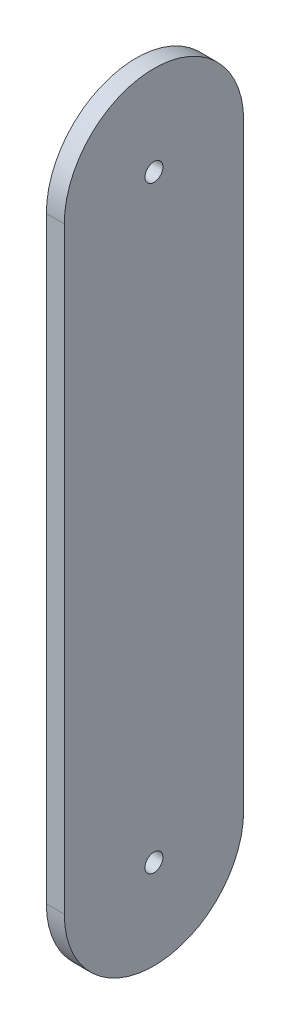
ISO-10303-21;
HEADER;
FILE_DESCRIPTION(('STEP AP214'),'2;1');
FILE_NAME('part.step','',(''),(''),'','','');
FILE_SCHEMA(('AUTOMOTIVE_DESIGN { 1 0 10303 214 1 1 1 1 }'));
ENDSEC;
DATA;
#1=APPLICATION_CONTEXT('core data for automotive mechanical design processes');
#2=APPLICATION_PROTOCOL_DEFINITION('international standard','automotive_design',2000,#1);
#3=PRODUCT_CONTEXT('',#1,'mechanical');
#4=PRODUCT('Part','Part','',(#3));
#5=PRODUCT_RELATED_PRODUCT_CATEGORY('part','',(#4));
#6=PRODUCT_DEFINITION_FORMATION('','',#4);
#7=PRODUCT_DEFINITION_CONTEXT('part definition',#1,'design');
#8=PRODUCT_DEFINITION('design','',#6,#7);
#9=PRODUCT_DEFINITION_SHAPE('','',#8);
#10=(LENGTH_UNIT() NAMED_UNIT(*) SI_UNIT(.MILLI.,.METRE.));
#11=(NAMED_UNIT(*) PLANE_ANGLE_UNIT() SI_UNIT($,.RADIAN.));
#12=(NAMED_UNIT(*) SI_UNIT($,.STERADIAN.) SOLID_ANGLE_UNIT());
#13=UNCERTAINTY_MEASURE_WITH_UNIT(LENGTH_MEASURE(1.E-05),#10,'distance_accuracy_value','');
#14=(GEOMETRIC_REPRESENTATION_CONTEXT(3) GLOBAL_UNCERTAINTY_ASSIGNED_CONTEXT((#13)) GLOBAL_UNIT_ASSIGNED_CONTEXT((#10,
#11,#12)) REPRESENTATION_CONTEXT('',''));
#15=CARTESIAN_POINT('',(0.,0.,0.));
#16=DIRECTION('',(0.,0.,1.));
#17=DIRECTION('',(1.,0.,0.));
#18=AXIS2_PLACEMENT_3D('',#15,#16,#17);
#19=CARTESIAN_POINT('',(3.,-50.,14.8301773529148));
#20=DIRECTION('',(-1.,0.,0.));
#21=DIRECTION('',(0.,0.,1.));
#22=AXIS2_PLACEMENT_3D('',#19,#20,#21);
#23=PLANE('',#22);
#24=CARTESIAN_POINT('',(3.,50.,14.8301773529148));
#25=DIRECTION('',(1.,0.,0.));
#26=DIRECTION('',(0.,0.,-1.));
#27=AXIS2_PLACEMENT_3D('',#24,#25,#26);
#28=CIRCLE('',#27,1.5);
#29=CARTESIAN_POINT('',(3.,50.,13.3301773529148));
#30=VERTEX_POINT('',#29);
#31=EDGE_CURVE('E145',#30,#30,#28,.T.);
#32=ORIENTED_EDGE('',*,*,#31,.F.);
#33=EDGE_LOOP('',(#32));
#34=FACE_BOUND('',#33,.T.);
#35=CARTESIAN_POINT('',(3.,-50.,14.8301773529148));
#36=DIRECTION('',(1.,0.,0.));
#37=DIRECTION('',(0.,0.,1.));
#38=AXIS2_PLACEMENT_3D('',#35,#36,#37);
#39=CIRCLE('',#38,15.);
#40=CARTESIAN_POINT('',(3.,-50.,29.8301773529148));
#41=VERTEX_POINT('',#40);
#42=CARTESIAN_POINT('',(3.,-50.,-0.169822647085245));
#43=VERTEX_POINT('',#42);
#44=EDGE_CURVE('E99',#41,#43,#39,.T.);
#45=ORIENTED_EDGE('',*,*,#44,.T.);
#46=DIRECTION('',(0.,1.,0.));
#47=VECTOR('',#46,1.);
#48=CARTESIAN_POINT('',(3.,50.,-0.169822647085245));
#49=LINE('',#48,#47);
#50=CARTESIAN_POINT('',(3.,50.,-0.169822647085245));
#51=VERTEX_POINT('',#50);
#52=EDGE_CURVE('E94',#43,#51,#49,.T.);
#53=ORIENTED_EDGE('',*,*,#52,.T.);
#54=CARTESIAN_POINT('',(3.,50.,14.8301773529148));
#55=DIRECTION('',(1.,0.,0.));
#56=DIRECTION('',(0.,0.,-1.));
#57=AXIS2_PLACEMENT_3D('',#54,#55,#56);
#58=CIRCLE('',#57,15.);
#59=CARTESIAN_POINT('',(3.,50.,29.8301773529148));
#60=VERTEX_POINT('',#59);
#61=EDGE_CURVE('E97',#51,#60,#58,.T.);
#62=ORIENTED_EDGE('',*,*,#61,.T.);
#63=DIRECTION('',(0.,-1.,0.));
#64=VECTOR('',#63,1.);
#65=CARTESIAN_POINT('',(3.,50.,29.8301773529148));
#66=LINE('',#65,#64);
#67=EDGE_CURVE('E64',#60,#41,#66,.T.);
#68=ORIENTED_EDGE('',*,*,#67,.T.);
#69=EDGE_LOOP('',(#45,#53,#62,#68));
#70=FACE_BOUND('',#69,.T.);
#71=CARTESIAN_POINT('',(3.,-50.,14.8301773529148));
#72=DIRECTION('',(1.,0.,0.));
#73=DIRECTION('',(0.,0.,-1.));
#74=AXIS2_PLACEMENT_3D('',#71,#72,#73);
#75=CIRCLE('',#74,1.5);
#76=CARTESIAN_POINT('',(3.,-50.,13.3301773529148));
#77=VERTEX_POINT('',#76);
#78=EDGE_CURVE('E120',#77,#77,#75,.T.);
#79=ORIENTED_EDGE('',*,*,#78,.F.);
#80=EDGE_LOOP('',(#79));
#81=FACE_BOUND('',#80,.T.);
#82=ADVANCED_FACE('F45',(#34,#70,#81),#23,.F.);
#83=CARTESIAN_POINT('',(0.,-50.,14.8301773529148));
#84=DIRECTION('',(-1.,0.,0.));
#85=DIRECTION('',(0.,0.,1.));
#86=AXIS2_PLACEMENT_3D('',#83,#84,#85);
#87=PLANE('',#86);
#88=CARTESIAN_POINT('',(0.,50.,14.8301773529148));
#89=DIRECTION('',(-1.,0.,0.));
#90=DIRECTION('',(0.,0.,1.));
#91=AXIS2_PLACEMENT_3D('',#88,#89,#90);
#92=CIRCLE('',#91,1.5);
#93=CARTESIAN_POINT('',(0.,50.,16.3301773529148));
#94=VERTEX_POINT('',#93);
#95=EDGE_CURVE('E49',#94,#94,#92,.T.);
#96=ORIENTED_EDGE('',*,*,#95,.F.);
#97=EDGE_LOOP('',(#96));
#98=FACE_BOUND('',#97,.T.);
#99=CARTESIAN_POINT('',(0.,-50.,14.8301773529148));
#100=DIRECTION('',(1.,0.,0.));
#101=DIRECTION('',(0.,0.,1.));
#102=AXIS2_PLACEMENT_3D('',#99,#100,#101);
#103=CIRCLE('',#102,15.);
#104=CARTESIAN_POINT('',(0.,-50.,29.8301773529148));
#105=VERTEX_POINT('',#104);
#106=CARTESIAN_POINT('',(0.,-50.,-0.169822647085245));
#107=VERTEX_POINT('',#106);
#108=EDGE_CURVE('E116',#105,#107,#103,.T.);
#109=ORIENTED_EDGE('',*,*,#108,.F.);
#110=DIRECTION('',(0.,-1.,0.));
#111=VECTOR('',#110,1.);
#112=CARTESIAN_POINT('',(0.,50.,29.8301773529148));
#113=LINE('',#112,#111);
#114=CARTESIAN_POINT('',(0.,50.,29.8301773529148));
#115=VERTEX_POINT('',#114);
#116=EDGE_CURVE('E87',#115,#105,#113,.T.);
#117=ORIENTED_EDGE('',*,*,#116,.F.);
#118=CARTESIAN_POINT('',(0.,50.,14.8301773529148));
#119=DIRECTION('',(1.,0.,0.));
#120=DIRECTION('',(0.,0.,-1.));
#121=AXIS2_PLACEMENT_3D('',#118,#119,#120);
#122=CIRCLE('',#121,15.);
#123=CARTESIAN_POINT('',(0.,50.,-0.169822647085245));
#124=VERTEX_POINT('',#123);
#125=EDGE_CURVE('E81',#124,#115,#122,.T.);
#126=ORIENTED_EDGE('',*,*,#125,.F.);
#127=DIRECTION('',(0.,1.,0.));
#128=VECTOR('',#127,1.);
#129=CARTESIAN_POINT('',(0.,50.,-0.169822647085245));
#130=LINE('',#129,#128);
#131=EDGE_CURVE('E104',#107,#124,#130,.T.);
#132=ORIENTED_EDGE('',*,*,#131,.F.);
#133=EDGE_LOOP('',(#109,#117,#126,#132));
#134=FACE_BOUND('',#133,.T.);
#135=CARTESIAN_POINT('',(0.,-50.,14.8301773529148));
#136=DIRECTION('',(1.,0.,0.));
#137=DIRECTION('',(0.,0.,-1.));
#138=AXIS2_PLACEMENT_3D('',#135,#136,#137);
#139=CIRCLE('',#138,1.5);
#140=CARTESIAN_POINT('',(0.,-50.,13.3301773529148));
#141=VERTEX_POINT('',#140);
#142=EDGE_CURVE('E138',#141,#141,#139,.T.);
#143=ORIENTED_EDGE('',*,*,#142,.T.);
#144=EDGE_LOOP('',(#143));
#145=FACE_BOUND('',#144,.T.);
#146=ADVANCED_FACE('F133',(#98,#134,#145),#87,.T.);
#147=CARTESIAN_POINT('',(3.,-50.,14.8301773529148));
#148=DIRECTION('',(-1.,0.,0.));
#149=DIRECTION('',(0.,0.,1.));
#150=AXIS2_PLACEMENT_3D('',#147,#148,#149);
#151=CYLINDRICAL_SURFACE('',#150,15.);
#152=ORIENTED_EDGE('',*,*,#108,.T.);
#153=DIRECTION('',(-1.,0.,0.));
#154=VECTOR('',#153,1.);
#155=CARTESIAN_POINT('',(3.,-50.,-0.169822647085245));
#156=LINE('',#155,#154);
#157=EDGE_CURVE('E11',#43,#107,#156,.T.);
#158=ORIENTED_EDGE('',*,*,#157,.F.);
#159=ORIENTED_EDGE('',*,*,#44,.F.);
#160=DIRECTION('',(-1.,0.,0.));
#161=VECTOR('',#160,1.);
#162=CARTESIAN_POINT('',(3.,-50.,29.8301773529148));
#163=LINE('',#162,#161);
#164=EDGE_CURVE('E112',#41,#105,#163,.T.);
#165=ORIENTED_EDGE('',*,*,#164,.T.);
#166=EDGE_LOOP('',(#152,#158,#159,#165));
#167=FACE_BOUND('',#166,.T.);
#168=ADVANCED_FACE('F47',(#167),#151,.T.);
#169=CARTESIAN_POINT('',(3.,50.,-0.169822647085245));
#170=DIRECTION('',(0.,0.,1.));
#171=DIRECTION('',(1.,0.,0.));
#172=AXIS2_PLACEMENT_3D('',#169,#170,#171);
#173=PLANE('',#172);
#174=ORIENTED_EDGE('',*,*,#131,.T.);
#175=DIRECTION('',(-1.,0.,0.));
#176=VECTOR('',#175,1.);
#177=CARTESIAN_POINT('',(3.,50.,-0.169822647085245));
#178=LINE('',#177,#176);
#179=EDGE_CURVE('E56',#51,#124,#178,.T.);
#180=ORIENTED_EDGE('',*,*,#179,.F.);
#181=ORIENTED_EDGE('',*,*,#52,.F.);
#182=ORIENTED_EDGE('',*,*,#157,.T.);
#183=EDGE_LOOP('',(#174,#180,#181,#182));
#184=FACE_BOUND('',#183,.T.);
#185=ADVANCED_FACE('F103',(#184),#173,.F.);
#186=CARTESIAN_POINT('',(3.,50.,14.8301773529148));
#187=DIRECTION('',(-1.,0.,0.));
#188=DIRECTION('',(0.,0.,1.));
#189=AXIS2_PLACEMENT_3D('',#186,#187,#188);
#190=CYLINDRICAL_SURFACE('',#189,15.);
#191=ORIENTED_EDGE('',*,*,#125,.T.);
#192=DIRECTION('',(-1.,0.,0.));
#193=VECTOR('',#192,1.);
#194=CARTESIAN_POINT('',(3.,50.,29.8301773529148));
#195=LINE('',#194,#193);
#196=EDGE_CURVE('E106',#60,#115,#195,.T.);
#197=ORIENTED_EDGE('',*,*,#196,.F.);
#198=ORIENTED_EDGE('',*,*,#61,.F.);
#199=ORIENTED_EDGE('',*,*,#179,.T.);
#200=EDGE_LOOP('',(#191,#197,#198,#199));
#201=FACE_BOUND('',#200,.T.);
#202=ADVANCED_FACE('F108',(#201),#190,.T.);
#203=CARTESIAN_POINT('',(3.,50.,29.8301773529148));
#204=DIRECTION('',(0.,0.,-1.));
#205=DIRECTION('',(0.,1.,0.));
#206=AXIS2_PLACEMENT_3D('',#203,#204,#205);
#207=PLANE('',#206);
#208=ORIENTED_EDGE('',*,*,#116,.T.);
#209=ORIENTED_EDGE('',*,*,#164,.F.);
#210=ORIENTED_EDGE('',*,*,#67,.F.);
#211=ORIENTED_EDGE('',*,*,#196,.T.);
#212=EDGE_LOOP('',(#208,#209,#210,#211));
#213=FACE_BOUND('',#212,.T.);
#214=ADVANCED_FACE('F130',(#213),#207,.F.);
#215=CARTESIAN_POINT('',(3.,-50.,14.8301773529148));
#216=DIRECTION('',(-1.,0.,0.));
#217=DIRECTION('',(0.,0.,1.));
#218=AXIS2_PLACEMENT_3D('',#215,#216,#217);
#219=CYLINDRICAL_SURFACE('',#218,1.5);
#220=ORIENTED_EDGE('',*,*,#78,.T.);
#221=EDGE_LOOP('',(#220));
#222=FACE_BOUND('',#221,.T.);
#223=ORIENTED_EDGE('',*,*,#142,.F.);
#224=EDGE_LOOP('',(#223));
#225=FACE_BOUND('',#224,.T.);
#226=ADVANCED_FACE('F169',(#222,#225),#219,.F.);
#227=CARTESIAN_POINT('',(-7.,50.,14.8301773529148));
#228=DIRECTION('',(1.,0.,0.));
#229=DIRECTION('',(0.,0.,-1.));
#230=AXIS2_PLACEMENT_3D('',#227,#228,#229);
#231=CYLINDRICAL_SURFACE('',#230,1.5);
#232=ORIENTED_EDGE('',*,*,#95,.T.);
#233=EDGE_LOOP('',(#232));
#234=FACE_BOUND('',#233,.T.);
#235=ORIENTED_EDGE('',*,*,#31,.T.);
#236=EDGE_LOOP('',(#235));
#237=FACE_BOUND('',#236,.T.);
#238=ADVANCED_FACE('F154',(#234,#237),#231,.F.);
#239=CLOSED_SHELL('',(#82,#146,#168,#185,#202,#214,#226,#238));
#240=MANIFOLD_SOLID_BREP('B2',#239);
#241=ADVANCED_BREP_SHAPE_REPRESENTATION('',(#18,#240),#14);
#242=SHAPE_DEFINITION_REPRESENTATION(#9,#241);
ENDSEC;
END-ISO-10303-21;
